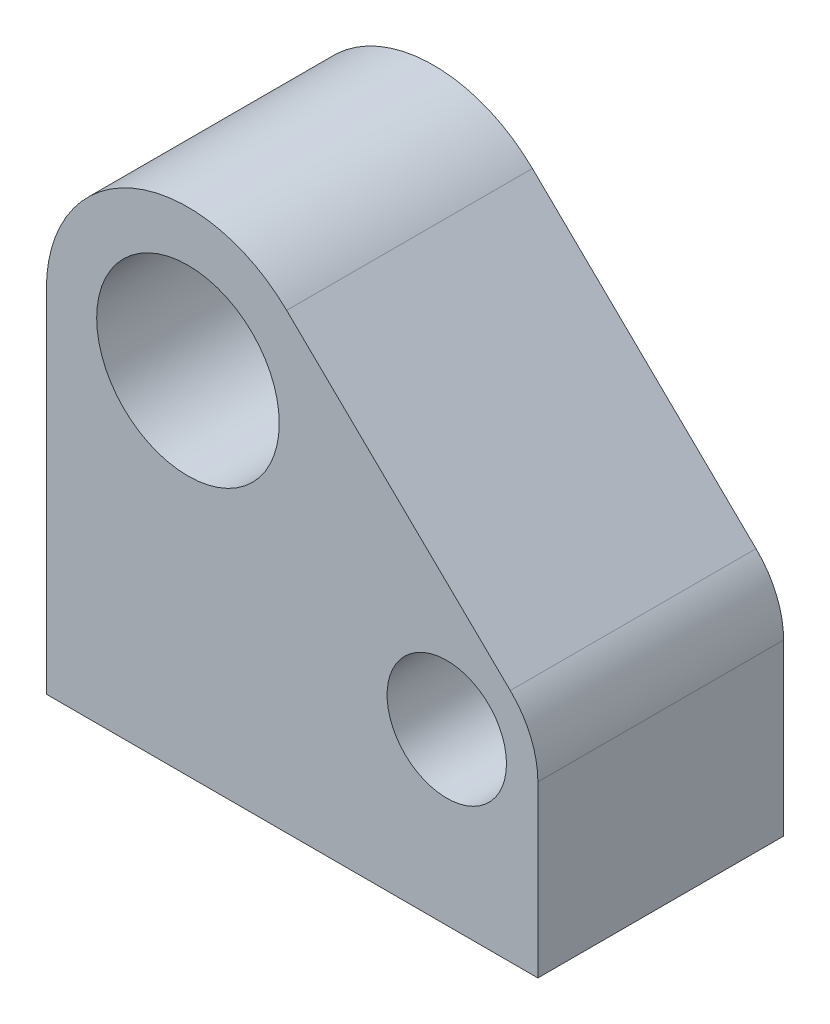
ISO-10303-21;
HEADER;
FILE_DESCRIPTION(('STEP AP214'),'2;1');
FILE_NAME('part.step','',(''),(''),'','','');
FILE_SCHEMA(('AUTOMOTIVE_DESIGN { 1 0 10303 214 1 1 1 1 }'));
ENDSEC;
DATA;
#1=APPLICATION_CONTEXT('core data for automotive mechanical design processes');
#2=APPLICATION_PROTOCOL_DEFINITION('international standard','automotive_design',2000,#1);
#3=PRODUCT_CONTEXT('',#1,'mechanical');
#4=PRODUCT('Part','Part','',(#3));
#5=PRODUCT_RELATED_PRODUCT_CATEGORY('part','',(#4));
#6=PRODUCT_DEFINITION_FORMATION('','',#4);
#7=PRODUCT_DEFINITION_CONTEXT('part definition',#1,'design');
#8=PRODUCT_DEFINITION('design','',#6,#7);
#9=PRODUCT_DEFINITION_SHAPE('','',#8);
#10=(LENGTH_UNIT() NAMED_UNIT(*) SI_UNIT(.MILLI.,.METRE.));
#11=(NAMED_UNIT(*) PLANE_ANGLE_UNIT() SI_UNIT($,.RADIAN.));
#12=(NAMED_UNIT(*) SI_UNIT($,.STERADIAN.) SOLID_ANGLE_UNIT());
#13=UNCERTAINTY_MEASURE_WITH_UNIT(LENGTH_MEASURE(1.E-05),#10,'distance_accuracy_value','');
#14=(GEOMETRIC_REPRESENTATION_CONTEXT(3) GLOBAL_UNCERTAINTY_ASSIGNED_CONTEXT((#13)) GLOBAL_UNIT_ASSIGNED_CONTEXT((#10,
#11,#12)) REPRESENTATION_CONTEXT('',''));
#15=CARTESIAN_POINT('',(0.,0.,0.));
#16=DIRECTION('',(0.,0.,1.));
#17=DIRECTION('',(1.,0.,0.));
#18=AXIS2_PLACEMENT_3D('',#15,#16,#17);
#19=CARTESIAN_POINT('',(0.,0.,7.));
#20=DIRECTION('',(0.,0.,1.));
#21=DIRECTION('',(1.,0.,0.));
#22=AXIS2_PLACEMENT_3D('',#19,#20,#21);
#23=PLANE('',#22);
#24=CARTESIAN_POINT('',(0.,0.,7.));
#25=DIRECTION('',(0.,0.,1.));
#26=DIRECTION('',(1.,0.,0.));
#27=AXIS2_PLACEMENT_3D('',#24,#25,#26);
#28=CIRCLE('',#27,2.6);
#29=CARTESIAN_POINT('',(2.6,0.,7.));
#30=VERTEX_POINT('',#29);
#31=EDGE_CURVE('E130',#30,#30,#28,.T.);
#32=ORIENTED_EDGE('',*,*,#31,.F.);
#33=EDGE_LOOP('',(#32));
#34=FACE_BOUND('',#33,.T.);
#35=CARTESIAN_POINT('',(0.,0.,7.));
#36=DIRECTION('',(0.,0.,1.));
#37=DIRECTION('',(1.,0.,0.));
#38=AXIS2_PLACEMENT_3D('',#35,#36,#37);
#39=CIRCLE('',#38,4.03276304618118);
#40=CARTESIAN_POINT('',(2.8111644453102,2.89145849841708,7.));
#41=VERTEX_POINT('',#40);
#42=CARTESIAN_POINT('',(-4.03276304618118,0.,7.));
#43=VERTEX_POINT('',#42);
#44=EDGE_CURVE('E137',#41,#43,#39,.T.);
#45=ORIENTED_EDGE('',*,*,#44,.T.);
#46=DIRECTION('',(0.,-1.,0.));
#47=VECTOR('',#46,1.);
#48=CARTESIAN_POINT('',(-4.03276304618118,0.,7.));
#49=LINE('',#48,#47);
#50=CARTESIAN_POINT('',(-4.03276304618118,-10.,7.));
#51=VERTEX_POINT('',#50);
#52=EDGE_CURVE('E95',#43,#51,#49,.T.);
#53=ORIENTED_EDGE('',*,*,#52,.T.);
#54=DIRECTION('',(1.,0.,0.));
#55=VECTOR('',#54,1.);
#56=CARTESIAN_POINT('',(9.96723695381882,-10.,7.));
#57=LINE('',#56,#55);
#58=CARTESIAN_POINT('',(9.96723695381882,-10.,7.));
#59=VERTEX_POINT('',#58);
#60=EDGE_CURVE('E108',#51,#59,#57,.T.);
#61=ORIENTED_EDGE('',*,*,#60,.T.);
#62=DIRECTION('',(0.,1.,0.));
#63=VECTOR('',#62,1.);
#64=CARTESIAN_POINT('',(9.96723695381882,-5.16218792715942,7.));
#65=LINE('',#64,#63);
#66=CARTESIAN_POINT('',(9.96723695381882,-5.16218792715942,7.));
#67=VERTEX_POINT('',#66);
#68=EDGE_CURVE('E102',#59,#67,#65,.T.);
#69=ORIENTED_EDGE('',*,*,#68,.T.);
#70=CARTESIAN_POINT('',(7.37236839860092,-5.16218792715942,7.));
#71=DIRECTION('',(0.,0.,1.));
#72=DIRECTION('',(1.,0.,0.));
#73=AXIS2_PLACEMENT_3D('',#70,#71,#72);
#74=CIRCLE('',#73,2.5948685552179);
#75=CARTESIAN_POINT('',(9.18120321957797,-3.30168815309882,7.));
#76=VERTEX_POINT('',#75);
#77=EDGE_CURVE('E106',#67,#76,#74,.T.);
#78=ORIENTED_EDGE('',*,*,#77,.T.);
#79=DIRECTION('',(-0.716991914800236,0.697081483121659,0.));
#80=VECTOR('',#79,1.);
#81=CARTESIAN_POINT('',(2.8111644453102,2.89145849841708,7.));
#82=LINE('',#81,#80);
#83=EDGE_CURVE('E58',#76,#41,#82,.T.);
#84=ORIENTED_EDGE('',*,*,#83,.T.);
#85=EDGE_LOOP('',(#45,#53,#61,#69,#78,#84));
#86=FACE_BOUND('',#85,.T.);
#87=CARTESIAN_POINT('',(7.37236839860092,-5.16218792715942,7.));
#88=DIRECTION('',(0.,0.,1.));
#89=DIRECTION('',(1.,0.,0.));
#90=AXIS2_PLACEMENT_3D('',#87,#88,#89);
#91=CIRCLE('',#90,1.7);
#92=CARTESIAN_POINT('',(9.07236839860092,-5.16218792715942,7.));
#93=VERTEX_POINT('',#92);
#94=EDGE_CURVE('E179',#93,#93,#91,.T.);
#95=ORIENTED_EDGE('',*,*,#94,.F.);
#96=EDGE_LOOP('',(#95));
#97=FACE_BOUND('',#96,.T.);
#98=ADVANCED_FACE('F41',(#34,#86,#97),#23,.T.);
#99=CARTESIAN_POINT('',(0.,0.,0.));
#100=DIRECTION('',(0.,0.,1.));
#101=DIRECTION('',(1.,0.,0.));
#102=AXIS2_PLACEMENT_3D('',#99,#100,#101);
#103=PLANE('',#102);
#104=CARTESIAN_POINT('',(0.,0.,0.));
#105=DIRECTION('',(0.,0.,1.));
#106=DIRECTION('',(1.,0.,0.));
#107=AXIS2_PLACEMENT_3D('',#104,#105,#106);
#108=CIRCLE('',#107,4.03276304618118);
#109=CARTESIAN_POINT('',(2.8111644453102,2.89145849841708,0.));
#110=VERTEX_POINT('',#109);
#111=CARTESIAN_POINT('',(-4.03276304618118,0.,0.));
#112=VERTEX_POINT('',#111);
#113=EDGE_CURVE('E126',#110,#112,#108,.T.);
#114=ORIENTED_EDGE('',*,*,#113,.F.);
#115=DIRECTION('',(-0.716991914800236,0.697081483121659,0.));
#116=VECTOR('',#115,1.);
#117=CARTESIAN_POINT('',(2.8111644453102,2.89145849841708,0.));
#118=LINE('',#117,#116);
#119=CARTESIAN_POINT('',(9.18120321957797,-3.30168815309882,0.));
#120=VERTEX_POINT('',#119);
#121=EDGE_CURVE('E87',#120,#110,#118,.T.);
#122=ORIENTED_EDGE('',*,*,#121,.F.);
#123=CARTESIAN_POINT('',(7.37236839860092,-5.16218792715942,0.));
#124=DIRECTION('',(0.,0.,1.));
#125=DIRECTION('',(1.,0.,0.));
#126=AXIS2_PLACEMENT_3D('',#123,#124,#125);
#127=CIRCLE('',#126,2.5948685552179);
#128=CARTESIAN_POINT('',(9.96723695381882,-5.16218792715942,0.));
#129=VERTEX_POINT('',#128);
#130=EDGE_CURVE('E81',#129,#120,#127,.T.);
#131=ORIENTED_EDGE('',*,*,#130,.F.);
#132=DIRECTION('',(0.,1.,0.));
#133=VECTOR('',#132,1.);
#134=CARTESIAN_POINT('',(9.96723695381882,-5.16218792715942,0.));
#135=LINE('',#134,#133);
#136=CARTESIAN_POINT('',(9.96723695381882,-10.,0.));
#137=VERTEX_POINT('',#136);
#138=EDGE_CURVE('E116',#137,#129,#135,.T.);
#139=ORIENTED_EDGE('',*,*,#138,.F.);
#140=DIRECTION('',(1.,0.,0.));
#141=VECTOR('',#140,1.);
#142=CARTESIAN_POINT('',(9.96723695381882,-10.,0.));
#143=LINE('',#142,#141);
#144=CARTESIAN_POINT('',(-4.03276304618118,-10.,0.));
#145=VERTEX_POINT('',#144);
#146=EDGE_CURVE('E132',#145,#137,#143,.T.);
#147=ORIENTED_EDGE('',*,*,#146,.F.);
#148=DIRECTION('',(0.,-1.,0.));
#149=VECTOR('',#148,1.);
#150=CARTESIAN_POINT('',(-4.03276304618118,0.,0.));
#151=LINE('',#150,#149);
#152=EDGE_CURVE('E129',#112,#145,#151,.T.);
#153=ORIENTED_EDGE('',*,*,#152,.F.);
#154=EDGE_LOOP('',(#114,#122,#131,#139,#147,#153));
#155=FACE_BOUND('',#154,.T.);
#156=CARTESIAN_POINT('',(0.,0.,0.));
#157=DIRECTION('',(0.,0.,1.));
#158=DIRECTION('',(1.,0.,0.));
#159=AXIS2_PLACEMENT_3D('',#156,#157,#158);
#160=CIRCLE('',#159,2.6);
#161=CARTESIAN_POINT('',(2.6,0.,0.));
#162=VERTEX_POINT('',#161);
#163=EDGE_CURVE('E185',#162,#162,#160,.T.);
#164=ORIENTED_EDGE('',*,*,#163,.T.);
#165=EDGE_LOOP('',(#164));
#166=FACE_BOUND('',#165,.T.);
#167=CARTESIAN_POINT('',(7.37236839860092,-5.16218792715942,0.));
#168=DIRECTION('',(0.,0.,1.));
#169=DIRECTION('',(1.,0.,0.));
#170=AXIS2_PLACEMENT_3D('',#167,#168,#169);
#171=CIRCLE('',#170,1.7);
#172=CARTESIAN_POINT('',(9.07236839860092,-5.16218792715942,0.));
#173=VERTEX_POINT('',#172);
#174=EDGE_CURVE('E182',#173,#173,#171,.T.);
#175=ORIENTED_EDGE('',*,*,#174,.T.);
#176=EDGE_LOOP('',(#175));
#177=FACE_BOUND('',#176,.T.);
#178=ADVANCED_FACE('F146',(#155,#166,#177),#103,.F.);
#179=CARTESIAN_POINT('',(0.,0.,7.));
#180=DIRECTION('',(0.,0.,-1.));
#181=DIRECTION('',(-1.,0.,0.));
#182=AXIS2_PLACEMENT_3D('',#179,#180,#181);
#183=CYLINDRICAL_SURFACE('',#182,4.03276304618118);
#184=ORIENTED_EDGE('',*,*,#113,.T.);
#185=DIRECTION('',(0.,0.,-1.));
#186=VECTOR('',#185,1.);
#187=CARTESIAN_POINT('',(-4.03276304618118,0.,7.));
#188=LINE('',#187,#186);
#189=EDGE_CURVE('E11',#43,#112,#188,.T.);
#190=ORIENTED_EDGE('',*,*,#189,.F.);
#191=ORIENTED_EDGE('',*,*,#44,.F.);
#192=DIRECTION('',(0.,0.,-1.));
#193=VECTOR('',#192,1.);
#194=CARTESIAN_POINT('',(2.8111644453102,2.89145849841708,7.));
#195=LINE('',#194,#193);
#196=EDGE_CURVE('E122',#41,#110,#195,.T.);
#197=ORIENTED_EDGE('',*,*,#196,.T.);
#198=EDGE_LOOP('',(#184,#190,#191,#197));
#199=FACE_BOUND('',#198,.T.);
#200=ADVANCED_FACE('F43',(#199),#183,.T.);
#201=CARTESIAN_POINT('',(-4.03276304618118,0.,7.));
#202=DIRECTION('',(1.,0.,0.));
#203=DIRECTION('',(0.,1.,0.));
#204=AXIS2_PLACEMENT_3D('',#201,#202,#203);
#205=PLANE('',#204);
#206=ORIENTED_EDGE('',*,*,#152,.T.);
#207=DIRECTION('',(0.,0.,-1.));
#208=VECTOR('',#207,1.);
#209=CARTESIAN_POINT('',(-4.03276304618118,-10.,7.));
#210=LINE('',#209,#208);
#211=EDGE_CURVE('E50',#51,#145,#210,.T.);
#212=ORIENTED_EDGE('',*,*,#211,.F.);
#213=ORIENTED_EDGE('',*,*,#52,.F.);
#214=ORIENTED_EDGE('',*,*,#189,.T.);
#215=EDGE_LOOP('',(#206,#212,#213,#214));
#216=FACE_BOUND('',#215,.T.);
#217=ADVANCED_FACE('F228',(#216),#205,.F.);
#218=CARTESIAN_POINT('',(9.96723695381882,-10.,7.));
#219=DIRECTION('',(0.,1.,0.));
#220=DIRECTION('',(-1.,0.,0.));
#221=AXIS2_PLACEMENT_3D('',#218,#219,#220);
#222=PLANE('',#221);
#223=ORIENTED_EDGE('',*,*,#146,.T.);
#224=DIRECTION('',(0.,0.,-1.));
#225=VECTOR('',#224,1.);
#226=CARTESIAN_POINT('',(9.96723695381882,-10.,7.));
#227=LINE('',#226,#225);
#228=EDGE_CURVE('E117',#59,#137,#227,.T.);
#229=ORIENTED_EDGE('',*,*,#228,.F.);
#230=ORIENTED_EDGE('',*,*,#60,.F.);
#231=ORIENTED_EDGE('',*,*,#211,.T.);
#232=EDGE_LOOP('',(#223,#229,#230,#231));
#233=FACE_BOUND('',#232,.T.);
#234=ADVANCED_FACE('F143',(#233),#222,.F.);
#235=CARTESIAN_POINT('',(9.96723695381882,-5.16218792715942,7.));
#236=DIRECTION('',(-1.,0.,0.));
#237=DIRECTION('',(0.,-1.,0.));
#238=AXIS2_PLACEMENT_3D('',#235,#236,#237);
#239=PLANE('',#238);
#240=ORIENTED_EDGE('',*,*,#138,.T.);
#241=DIRECTION('',(0.,0.,-1.));
#242=VECTOR('',#241,1.);
#243=CARTESIAN_POINT('',(9.96723695381882,-5.16218792715942,7.));
#244=LINE('',#243,#242);
#245=EDGE_CURVE('E113',#67,#129,#244,.T.);
#246=ORIENTED_EDGE('',*,*,#245,.F.);
#247=ORIENTED_EDGE('',*,*,#68,.F.);
#248=ORIENTED_EDGE('',*,*,#228,.T.);
#249=EDGE_LOOP('',(#240,#246,#247,#248));
#250=FACE_BOUND('',#249,.T.);
#251=ADVANCED_FACE('F114',(#250),#239,.F.);
#252=CARTESIAN_POINT('',(7.37236839860092,-5.16218792715942,7.));
#253=DIRECTION('',(0.,0.,-1.));
#254=DIRECTION('',(-1.,0.,0.));
#255=AXIS2_PLACEMENT_3D('',#252,#253,#254);
#256=CYLINDRICAL_SURFACE('',#255,2.5948685552179);
#257=ORIENTED_EDGE('',*,*,#130,.T.);
#258=DIRECTION('',(0.,0.,-1.));
#259=VECTOR('',#258,1.);
#260=CARTESIAN_POINT('',(9.18120321957797,-3.30168815309882,7.));
#261=LINE('',#260,#259);
#262=EDGE_CURVE('E118',#76,#120,#261,.T.);
#263=ORIENTED_EDGE('',*,*,#262,.F.);
#264=ORIENTED_EDGE('',*,*,#77,.F.);
#265=ORIENTED_EDGE('',*,*,#245,.T.);
#266=EDGE_LOOP('',(#257,#263,#264,#265));
#267=FACE_BOUND('',#266,.T.);
#268=ADVANCED_FACE('F120',(#267),#256,.T.);
#269=CARTESIAN_POINT('',(2.8111644453102,2.89145849841708,7.));
#270=DIRECTION('',(-0.697081483121659,-0.716991914800236,0.));
#271=DIRECTION('',(0.716991914800236,-0.697081483121659,0.));
#272=AXIS2_PLACEMENT_3D('',#269,#270,#271);
#273=PLANE('',#272);
#274=ORIENTED_EDGE('',*,*,#121,.T.);
#275=ORIENTED_EDGE('',*,*,#196,.F.);
#276=ORIENTED_EDGE('',*,*,#83,.F.);
#277=ORIENTED_EDGE('',*,*,#262,.T.);
#278=EDGE_LOOP('',(#274,#275,#276,#277));
#279=FACE_BOUND('',#278,.T.);
#280=ADVANCED_FACE('F151',(#279),#273,.F.);
#281=CARTESIAN_POINT('',(0.,0.,7.));
#282=DIRECTION('',(0.,0.,-1.));
#283=DIRECTION('',(-1.,0.,0.));
#284=AXIS2_PLACEMENT_3D('',#281,#282,#283);
#285=CYLINDRICAL_SURFACE('',#284,2.6);
#286=ORIENTED_EDGE('',*,*,#31,.T.);
#287=EDGE_LOOP('',(#286));
#288=FACE_BOUND('',#287,.T.);
#289=ORIENTED_EDGE('',*,*,#163,.F.);
#290=EDGE_LOOP('',(#289));
#291=FACE_BOUND('',#290,.T.);
#292=ADVANCED_FACE('F153',(#288,#291),#285,.F.);
#293=CARTESIAN_POINT('',(7.37236839860092,-5.16218792715942,7.));
#294=DIRECTION('',(0.,0.,-1.));
#295=DIRECTION('',(-1.,0.,0.));
#296=AXIS2_PLACEMENT_3D('',#293,#294,#295);
#297=CYLINDRICAL_SURFACE('',#296,1.7);
#298=ORIENTED_EDGE('',*,*,#94,.T.);
#299=EDGE_LOOP('',(#298));
#300=FACE_BOUND('',#299,.T.);
#301=ORIENTED_EDGE('',*,*,#174,.F.);
#302=EDGE_LOOP('',(#301));
#303=FACE_BOUND('',#302,.T.);
#304=ADVANCED_FACE('F159',(#300,#303),#297,.F.);
#305=CLOSED_SHELL('',(#98,#178,#200,#217,#234,#251,#268,#280,#292,#304));
#306=MANIFOLD_SOLID_BREP('B2',#305);
#307=ADVANCED_BREP_SHAPE_REPRESENTATION('',(#18,#306),#14);
#308=SHAPE_DEFINITION_REPRESENTATION(#9,#307);
ENDSEC;
END-ISO-10303-21;
